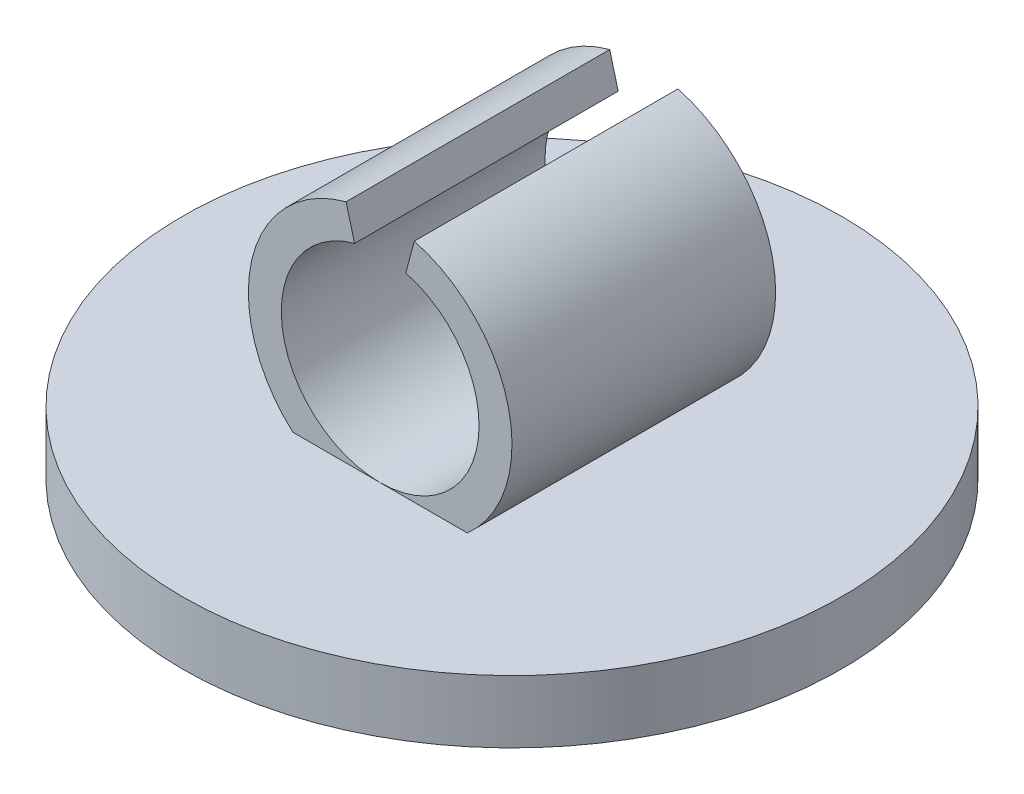
ISO-10303-21;
HEADER;
FILE_DESCRIPTION(('STEP AP214'),'2;1');
FILE_NAME('part.step','',(''),(''),'','','');
FILE_SCHEMA(('AUTOMOTIVE_DESIGN { 1 0 10303 214 1 1 1 1 }'));
ENDSEC;
DATA;
#1=APPLICATION_CONTEXT('core data for automotive mechanical design processes');
#2=APPLICATION_PROTOCOL_DEFINITION('international standard','automotive_design',2000,#1);
#3=PRODUCT_CONTEXT('',#1,'mechanical');
#4=PRODUCT('Part','Part','',(#3));
#5=PRODUCT_RELATED_PRODUCT_CATEGORY('part','',(#4));
#6=PRODUCT_DEFINITION_FORMATION('','',#4);
#7=PRODUCT_DEFINITION_CONTEXT('part definition',#1,'design');
#8=PRODUCT_DEFINITION('design','',#6,#7);
#9=PRODUCT_DEFINITION_SHAPE('','',#8);
#10=(LENGTH_UNIT() NAMED_UNIT(*) SI_UNIT(.MILLI.,.METRE.));
#11=(NAMED_UNIT(*) PLANE_ANGLE_UNIT() SI_UNIT($,.RADIAN.));
#12=(NAMED_UNIT(*) SI_UNIT($,.STERADIAN.) SOLID_ANGLE_UNIT());
#13=UNCERTAINTY_MEASURE_WITH_UNIT(LENGTH_MEASURE(1.E-05),#10,'distance_accuracy_value','');
#14=(GEOMETRIC_REPRESENTATION_CONTEXT(3) GLOBAL_UNCERTAINTY_ASSIGNED_CONTEXT((#13)) GLOBAL_UNIT_ASSIGNED_CONTEXT((#10,
#11,#12)) REPRESENTATION_CONTEXT('',''));
#15=CARTESIAN_POINT('',(0.,0.,0.));
#16=DIRECTION('',(0.,0.,1.));
#17=DIRECTION('',(1.,0.,0.));
#18=AXIS2_PLACEMENT_3D('',#15,#16,#17);
#19=CARTESIAN_POINT('',(25.,12.2527648428405,0.));
#20=DIRECTION('',(0.,1.,0.));
#21=DIRECTION('',(0.,0.,1.));
#22=AXIS2_PLACEMENT_3D('',#19,#20,#21);
#23=PLANE('',#22);
#24=CARTESIAN_POINT('',(0.,12.2527648428405,0.));
#25=DIRECTION('',(0.,-1.,0.));
#26=DIRECTION('',(0.,0.,-1.));
#27=AXIS2_PLACEMENT_3D('',#24,#25,#26);
#28=CIRCLE('',#27,25.);
#29=CARTESIAN_POINT('',(0.,12.2527648428405,-25.));
#30=VERTEX_POINT('',#29);
#31=EDGE_CURVE('E134',#30,#30,#28,.T.);
#32=ORIENTED_EDGE('',*,*,#31,.F.);
#33=EDGE_LOOP('',(#32));
#34=FACE_BOUND('',#33,.T.);
#35=DIRECTION('',(0.,0.,1.));
#36=VECTOR('',#35,1.);
#37=CARTESIAN_POINT('',(-6.61437827766147,12.2527648428405,-10.));
#38=LINE('',#37,#36);
#39=CARTESIAN_POINT('',(-6.61437827766147,12.2527648428405,-10.));
#40=VERTEX_POINT('',#39);
#41=CARTESIAN_POINT('',(-6.61437827766147,12.2527648428405,10.));
#42=VERTEX_POINT('',#41);
#43=EDGE_CURVE('E50',#40,#42,#38,.T.);
#44=ORIENTED_EDGE('',*,*,#43,.F.);
#45=DIRECTION('',(1.,0.,0.));
#46=VECTOR('',#45,1.);
#47=CARTESIAN_POINT('',(25.,12.2527648428405,-10.));
#48=LINE('',#47,#46);
#49=CARTESIAN_POINT('',(0.,12.2527648428405,-10.));
#50=VERTEX_POINT('',#49);
#51=EDGE_CURVE('E11',#40,#50,#48,.T.);
#52=ORIENTED_EDGE('',*,*,#51,.T.);
#53=CARTESIAN_POINT('',(6.61437827766147,12.2527648428405,-10.));
#54=VERTEX_POINT('',#53);
#55=EDGE_CURVE('E36',#50,#54,#48,.T.);
#56=ORIENTED_EDGE('',*,*,#55,.T.);
#57=DIRECTION('',(0.,0.,1.));
#58=VECTOR('',#57,1.);
#59=CARTESIAN_POINT('',(6.61437827766147,12.2527648428405,-10.));
#60=LINE('',#59,#58);
#61=CARTESIAN_POINT('',(6.61437827766147,12.2527648428405,10.));
#62=VERTEX_POINT('',#61);
#63=EDGE_CURVE('E153',#62,#54,#60,.F.);
#64=ORIENTED_EDGE('',*,*,#63,.F.);
#65=DIRECTION('',(1.,0.,0.));
#66=VECTOR('',#65,1.);
#67=CARTESIAN_POINT('',(25.,12.2527648428405,10.));
#68=LINE('',#67,#66);
#69=CARTESIAN_POINT('',(0.,12.2527648428405,10.));
#70=VERTEX_POINT('',#69);
#71=EDGE_CURVE('E150',#70,#62,#68,.T.);
#72=ORIENTED_EDGE('',*,*,#71,.F.);
#73=EDGE_CURVE('E95',#42,#70,#68,.T.);
#74=ORIENTED_EDGE('',*,*,#73,.F.);
#75=EDGE_LOOP('',(#44,#52,#56,#64,#72,#74));
#76=FACE_BOUND('',#75,.T.);
#77=ADVANCED_FACE('F32',(#34,#76),#23,.T.);
#78=CARTESIAN_POINT('',(0.,0.,0.));
#79=DIRECTION('',(0.,-1.,0.));
#80=DIRECTION('',(0.,0.,-1.));
#81=AXIS2_PLACEMENT_3D('',#78,#79,#80);
#82=PLANE('',#81);
#83=CARTESIAN_POINT('',(0.,0.,0.));
#84=DIRECTION('',(0.,-1.,0.));
#85=DIRECTION('',(0.,0.,-1.));
#86=AXIS2_PLACEMENT_3D('',#83,#84,#85);
#87=CIRCLE('',#86,3.75);
#88=CARTESIAN_POINT('',(0.,0.,-3.75));
#89=VERTEX_POINT('',#88);
#90=EDGE_CURVE('E147',#89,#89,#87,.T.);
#91=ORIENTED_EDGE('',*,*,#90,.T.);
#92=EDGE_LOOP('',(#91));
#93=FACE_BOUND('',#92,.T.);
#94=ADVANCED_FACE('F34',(#93),#82,.T.);
#95=CARTESIAN_POINT('',(0.,0.,0.));
#96=DIRECTION('',(0.,-1.,0.));
#97=DIRECTION('',(0.,0.,-1.));
#98=AXIS2_PLACEMENT_3D('',#95,#96,#97);
#99=CYLINDRICAL_SURFACE('',#98,3.75);
#100=CARTESIAN_POINT('',(0.,7.5,0.));
#101=DIRECTION('',(0.,-1.,0.));
#102=DIRECTION('',(0.,0.,-1.));
#103=AXIS2_PLACEMENT_3D('',#100,#101,#102);
#104=CIRCLE('',#103,3.75);
#105=CARTESIAN_POINT('',(0.,7.5,-3.75));
#106=VERTEX_POINT('',#105);
#107=EDGE_CURVE('E144',#106,#106,#104,.T.);
#108=ORIENTED_EDGE('',*,*,#107,.T.);
#109=EDGE_LOOP('',(#108));
#110=FACE_BOUND('',#109,.T.);
#111=ORIENTED_EDGE('',*,*,#90,.F.);
#112=EDGE_LOOP('',(#111));
#113=FACE_BOUND('',#112,.T.);
#114=ADVANCED_FACE('F184',(#110,#113),#99,.T.);
#115=CARTESIAN_POINT('',(3.75,7.5,0.));
#116=DIRECTION('',(0.,-1.,0.));
#117=DIRECTION('',(0.,0.,-1.));
#118=AXIS2_PLACEMENT_3D('',#115,#116,#117);
#119=PLANE('',#118);
#120=CARTESIAN_POINT('',(0.,7.5,0.));
#121=DIRECTION('',(0.,-1.,0.));
#122=DIRECTION('',(0.,0.,-1.));
#123=AXIS2_PLACEMENT_3D('',#120,#121,#122);
#124=CIRCLE('',#123,25.);
#125=CARTESIAN_POINT('',(0.,7.5,-25.));
#126=VERTEX_POINT('',#125);
#127=EDGE_CURVE('E141',#126,#126,#124,.T.);
#128=ORIENTED_EDGE('',*,*,#127,.T.);
#129=EDGE_LOOP('',(#128));
#130=FACE_BOUND('',#129,.T.);
#131=ORIENTED_EDGE('',*,*,#107,.F.);
#132=EDGE_LOOP('',(#131));
#133=FACE_BOUND('',#132,.T.);
#134=ADVANCED_FACE('F193',(#130,#133),#119,.T.);
#135=CARTESIAN_POINT('',(0.,0.,0.));
#136=DIRECTION('',(0.,-1.,0.));
#137=DIRECTION('',(0.,0.,-1.));
#138=AXIS2_PLACEMENT_3D('',#135,#136,#137);
#139=CYLINDRICAL_SURFACE('',#138,25.);
#140=ORIENTED_EDGE('',*,*,#31,.T.);
#141=EDGE_LOOP('',(#140));
#142=FACE_BOUND('',#141,.T.);
#143=ORIENTED_EDGE('',*,*,#127,.F.);
#144=EDGE_LOOP('',(#143));
#145=FACE_BOUND('',#144,.T.);
#146=ADVANCED_FACE('F190',(#142,#145),#139,.T.);
#147=CARTESIAN_POINT('',(0.,19.7527648428405,-10.));
#148=DIRECTION('',(0.,0.,1.));
#149=DIRECTION('',(1.,0.,0.));
#150=AXIS2_PLACEMENT_3D('',#147,#148,#149);
#151=CYLINDRICAL_SURFACE('',#150,7.5);
#152=CARTESIAN_POINT('',(0.,19.7527648428405,-10.));
#153=DIRECTION('',(0.,0.,-1.));
#154=DIRECTION('',(1.,0.,0.));
#155=AXIS2_PLACEMENT_3D('',#152,#153,#154);
#156=CIRCLE('',#155,7.5);
#157=CARTESIAN_POINT('',(1.94114283826894,26.9972085400085,-10.));
#158=VERTEX_POINT('',#157);
#159=EDGE_CURVE('E122',#158,#50,#156,.T.);
#160=ORIENTED_EDGE('',*,*,#159,.T.);
#161=CARTESIAN_POINT('',(-1.94114283826894,26.9972085400085,-10.));
#162=VERTEX_POINT('',#161);
#163=EDGE_CURVE('E106',#50,#162,#156,.T.);
#164=ORIENTED_EDGE('',*,*,#163,.T.);
#165=DIRECTION('',(0.,0.,1.));
#166=VECTOR('',#165,1.);
#167=CARTESIAN_POINT('',(-1.94114283826894,26.9972085400085,-10.));
#168=LINE('',#167,#166);
#169=CARTESIAN_POINT('',(-1.94114283826894,26.9972085400085,10.));
#170=VERTEX_POINT('',#169);
#171=EDGE_CURVE('E102',#162,#170,#168,.T.);
#172=ORIENTED_EDGE('',*,*,#171,.T.);
#173=CARTESIAN_POINT('',(0.,19.7527648428405,10.));
#174=DIRECTION('',(0.,0.,-1.));
#175=DIRECTION('',(1.,0.,0.));
#176=AXIS2_PLACEMENT_3D('',#173,#174,#175);
#177=CIRCLE('',#176,7.5);
#178=EDGE_CURVE('E88',#70,#170,#177,.T.);
#179=ORIENTED_EDGE('',*,*,#178,.F.);
#180=CARTESIAN_POINT('',(1.94114283826894,26.9972085400085,10.));
#181=VERTEX_POINT('',#180);
#182=EDGE_CURVE('E99',#181,#70,#177,.T.);
#183=ORIENTED_EDGE('',*,*,#182,.F.);
#184=DIRECTION('',(0.,0.,1.));
#185=VECTOR('',#184,1.);
#186=CARTESIAN_POINT('',(1.94114283826894,26.9972085400085,-10.));
#187=LINE('',#186,#185);
#188=EDGE_CURVE('E132',#158,#181,#187,.T.);
#189=ORIENTED_EDGE('',*,*,#188,.F.);
#190=EDGE_LOOP('',(#160,#164,#172,#179,#183,#189));
#191=FACE_BOUND('',#190,.T.);
#192=ADVANCED_FACE('F104',(#191),#151,.F.);
#193=CARTESIAN_POINT('',(0.,19.7527648428405,-10.));
#194=DIRECTION('',(0.,0.,1.));
#195=DIRECTION('',(1.,0.,0.));
#196=AXIS2_PLACEMENT_3D('',#193,#194,#195);
#197=CYLINDRICAL_SURFACE('',#196,10.);
#198=CARTESIAN_POINT('',(0.,19.7527648428405,-10.));
#199=DIRECTION('',(0.,0.,1.));
#200=DIRECTION('',(1.,0.,0.));
#201=AXIS2_PLACEMENT_3D('',#198,#199,#200);
#202=CIRCLE('',#201,10.);
#203=CARTESIAN_POINT('',(-2.58819045102525,29.4120231057312,-10.));
#204=VERTEX_POINT('',#203);
#205=EDGE_CURVE('E127',#204,#40,#202,.T.);
#206=ORIENTED_EDGE('',*,*,#205,.T.);
#207=ORIENTED_EDGE('',*,*,#43,.T.);
#208=CARTESIAN_POINT('',(0.,19.7527648428405,10.));
#209=DIRECTION('',(0.,0.,1.));
#210=DIRECTION('',(1.,0.,0.));
#211=AXIS2_PLACEMENT_3D('',#208,#209,#210);
#212=CIRCLE('',#211,10.);
#213=CARTESIAN_POINT('',(-2.58819045102525,29.4120231057312,10.));
#214=VERTEX_POINT('',#213);
#215=EDGE_CURVE('E116',#214,#42,#212,.T.);
#216=ORIENTED_EDGE('',*,*,#215,.F.);
#217=DIRECTION('',(0.,0.,1.));
#218=VECTOR('',#217,1.);
#219=CARTESIAN_POINT('',(-2.58819045102525,29.4120231057312,-10.));
#220=LINE('',#219,#218);
#221=EDGE_CURVE('E110',#204,#214,#220,.T.);
#222=ORIENTED_EDGE('',*,*,#221,.F.);
#223=EDGE_LOOP('',(#206,#207,#216,#222));
#224=FACE_BOUND('',#223,.T.);
#225=ADVANCED_FACE('F221',(#224),#197,.T.);
#226=CARTESIAN_POINT('',(0.,19.7527648428405,-10.));
#227=DIRECTION('',(0.,0.,1.));
#228=DIRECTION('',(1.,0.,0.));
#229=AXIS2_PLACEMENT_3D('',#226,#227,#228);
#230=PLANE('',#229);
#231=ORIENTED_EDGE('',*,*,#51,.F.);
#232=ORIENTED_EDGE('',*,*,#205,.F.);
#233=DIRECTION('',(-0.258819045102525,0.965925826289067,0.));
#234=VECTOR('',#233,1.);
#235=CARTESIAN_POINT('',(-1.94114283826894,26.9972085400085,-10.));
#236=LINE('',#235,#234);
#237=EDGE_CURVE('E124',#162,#204,#236,.T.);
#238=ORIENTED_EDGE('',*,*,#237,.F.);
#239=ORIENTED_EDGE('',*,*,#163,.F.);
#240=EDGE_LOOP('',(#231,#232,#238,#239));
#241=FACE_BOUND('',#240,.T.);
#242=ADVANCED_FACE('F176',(#241),#230,.F.);
#243=CARTESIAN_POINT('',(0.,19.7527648428405,10.));
#244=DIRECTION('',(0.,0.,1.));
#245=DIRECTION('',(1.,0.,0.));
#246=AXIS2_PLACEMENT_3D('',#243,#244,#245);
#247=PLANE('',#246);
#248=ORIENTED_EDGE('',*,*,#215,.T.);
#249=ORIENTED_EDGE('',*,*,#73,.T.);
#250=ORIENTED_EDGE('',*,*,#178,.T.);
#251=DIRECTION('',(-0.258819045102525,0.965925826289067,0.));
#252=VECTOR('',#251,1.);
#253=CARTESIAN_POINT('',(-1.94114283826894,26.9972085400085,10.));
#254=LINE('',#253,#252);
#255=EDGE_CURVE('E93',#170,#214,#254,.T.);
#256=ORIENTED_EDGE('',*,*,#255,.T.);
#257=EDGE_LOOP('',(#248,#249,#250,#256));
#258=FACE_BOUND('',#257,.T.);
#259=ADVANCED_FACE('F91',(#258),#247,.T.);
#260=CARTESIAN_POINT('',(1.94114283826894,26.9972085400085,-10.));
#261=DIRECTION('',(-0.965925826289067,0.258819045102525,0.));
#262=DIRECTION('',(-0.258819045102525,-0.965925826289067,0.));
#263=AXIS2_PLACEMENT_3D('',#260,#261,#262);
#264=PLANE('',#263);
#265=ORIENTED_EDGE('',*,*,#188,.T.);
#266=DIRECTION('',(-0.258819045102525,-0.965925826289067,0.));
#267=VECTOR('',#266,1.);
#268=CARTESIAN_POINT('',(1.94114283826894,26.9972085400085,10.));
#269=LINE('',#268,#267);
#270=CARTESIAN_POINT('',(2.58819045102525,29.4120231057312,10.));
#271=VERTEX_POINT('',#270);
#272=EDGE_CURVE('E119',#271,#181,#269,.T.);
#273=ORIENTED_EDGE('',*,*,#272,.F.);
#274=DIRECTION('',(0.,0.,1.));
#275=VECTOR('',#274,1.);
#276=CARTESIAN_POINT('',(2.58819045102525,29.4120231057312,-10.));
#277=LINE('',#276,#275);
#278=CARTESIAN_POINT('',(2.58819045102525,29.4120231057312,-10.));
#279=VERTEX_POINT('',#278);
#280=EDGE_CURVE('E135',#279,#271,#277,.T.);
#281=ORIENTED_EDGE('',*,*,#280,.F.);
#282=DIRECTION('',(-0.258819045102525,-0.965925826289067,0.));
#283=VECTOR('',#282,1.);
#284=CARTESIAN_POINT('',(1.94114283826894,26.9972085400085,-10.));
#285=LINE('',#284,#283);
#286=EDGE_CURVE('E111',#279,#158,#285,.T.);
#287=ORIENTED_EDGE('',*,*,#286,.T.);
#288=EDGE_LOOP('',(#265,#273,#281,#287));
#289=FACE_BOUND('',#288,.T.);
#290=ADVANCED_FACE('F166',(#289),#264,.T.);
#291=EDGE_CURVE('E114',#62,#271,#212,.T.);
#292=ORIENTED_EDGE('',*,*,#291,.F.);
#293=ORIENTED_EDGE('',*,*,#63,.T.);
#294=EDGE_CURVE('E126',#54,#279,#202,.T.);
#295=ORIENTED_EDGE('',*,*,#294,.T.);
#296=ORIENTED_EDGE('',*,*,#280,.T.);
#297=EDGE_LOOP('',(#292,#293,#295,#296));
#298=FACE_BOUND('',#297,.T.);
#299=ADVANCED_FACE('F161',(#298),#197,.T.);
#300=CARTESIAN_POINT('',(-1.94114283826894,26.9972085400085,-10.));
#301=DIRECTION('',(0.965925826289067,0.258819045102525,0.));
#302=DIRECTION('',(-0.258819045102525,0.965925826289067,0.));
#303=AXIS2_PLACEMENT_3D('',#300,#301,#302);
#304=PLANE('',#303);
#305=ORIENTED_EDGE('',*,*,#221,.T.);
#306=ORIENTED_EDGE('',*,*,#255,.F.);
#307=ORIENTED_EDGE('',*,*,#171,.F.);
#308=ORIENTED_EDGE('',*,*,#237,.T.);
#309=EDGE_LOOP('',(#305,#306,#307,#308));
#310=FACE_BOUND('',#309,.T.);
#311=ADVANCED_FACE('F113',(#310),#304,.T.);
#312=ORIENTED_EDGE('',*,*,#55,.F.);
#313=ORIENTED_EDGE('',*,*,#159,.F.);
#314=ORIENTED_EDGE('',*,*,#286,.F.);
#315=ORIENTED_EDGE('',*,*,#294,.F.);
#316=EDGE_LOOP('',(#312,#313,#314,#315));
#317=FACE_BOUND('',#316,.T.);
#318=ADVANCED_FACE('F164',(#317),#230,.F.);
#319=ORIENTED_EDGE('',*,*,#182,.T.);
#320=ORIENTED_EDGE('',*,*,#71,.T.);
#321=ORIENTED_EDGE('',*,*,#291,.T.);
#322=ORIENTED_EDGE('',*,*,#272,.T.);
#323=EDGE_LOOP('',(#319,#320,#321,#322));
#324=FACE_BOUND('',#323,.T.);
#325=ADVANCED_FACE('F169',(#324),#247,.T.);
#326=CLOSED_SHELL('',(#77,#94,#114,#134,#146,#192,#225,#242,#259,#290,#299,#311,#318,#325));
#327=MANIFOLD_SOLID_BREP('B2',#326);
#328=ADVANCED_BREP_SHAPE_REPRESENTATION('',(#18,#327),#14);
#329=SHAPE_DEFINITION_REPRESENTATION(#9,#328);
ENDSEC;
END-ISO-10303-21;
